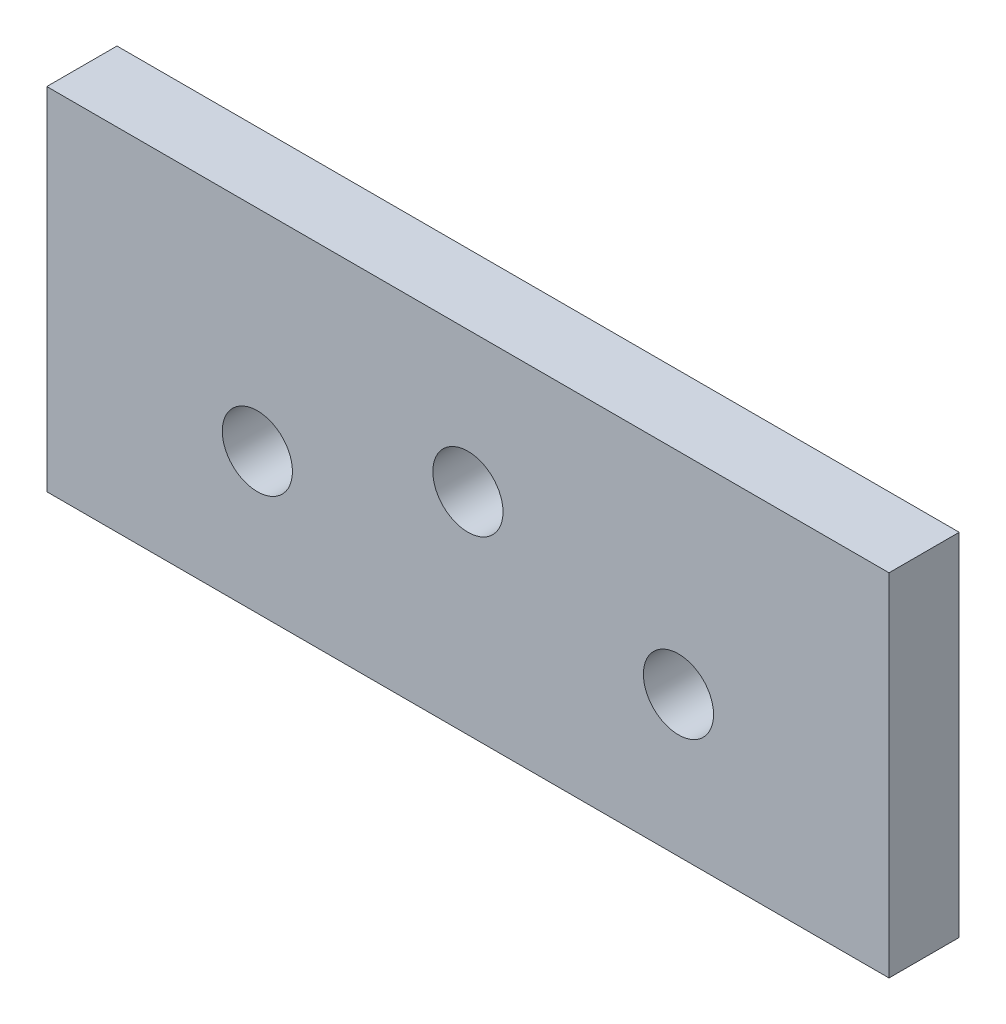
ISO-10303-21;
HEADER;
FILE_DESCRIPTION(('STEP AP214'),'2;1');
FILE_NAME('part.step','',(''),(''),'','','');
FILE_SCHEMA(('AUTOMOTIVE_DESIGN { 1 0 10303 214 1 1 1 1 }'));
ENDSEC;
DATA;
#1=APPLICATION_CONTEXT('core data for automotive mechanical design processes');
#2=APPLICATION_PROTOCOL_DEFINITION('international standard','automotive_design',2000,#1);
#3=PRODUCT_CONTEXT('',#1,'mechanical');
#4=PRODUCT('Part','Part','',(#3));
#5=PRODUCT_RELATED_PRODUCT_CATEGORY('part','',(#4));
#6=PRODUCT_DEFINITION_FORMATION('','',#4);
#7=PRODUCT_DEFINITION_CONTEXT('part definition',#1,'design');
#8=PRODUCT_DEFINITION('design','',#6,#7);
#9=PRODUCT_DEFINITION_SHAPE('','',#8);
#10=(LENGTH_UNIT() NAMED_UNIT(*) SI_UNIT(.MILLI.,.METRE.));
#11=(NAMED_UNIT(*) PLANE_ANGLE_UNIT() SI_UNIT($,.RADIAN.));
#12=(NAMED_UNIT(*) SI_UNIT($,.STERADIAN.) SOLID_ANGLE_UNIT());
#13=UNCERTAINTY_MEASURE_WITH_UNIT(LENGTH_MEASURE(1.E-05),#10,'distance_accuracy_value','');
#14=(GEOMETRIC_REPRESENTATION_CONTEXT(3) GLOBAL_UNCERTAINTY_ASSIGNED_CONTEXT((#13)) GLOBAL_UNIT_ASSIGNED_CONTEXT((#10,
#11,#12)) REPRESENTATION_CONTEXT('',''));
#15=CARTESIAN_POINT('',(0.,0.,0.));
#16=DIRECTION('',(0.,0.,1.));
#17=DIRECTION('',(1.,0.,0.));
#18=AXIS2_PLACEMENT_3D('',#15,#16,#17);
#19=CARTESIAN_POINT('',(0.,0.,10.));
#20=DIRECTION('',(0.,0.,1.));
#21=DIRECTION('',(1.,0.,0.));
#22=AXIS2_PLACEMENT_3D('',#19,#20,#21);
#23=PLANE('',#22);
#24=CARTESIAN_POINT('',(39.8281786941581,-30.,10.));
#25=DIRECTION('',(0.,0.,1.));
#26=DIRECTION('',(1.,0.,0.));
#27=AXIS2_PLACEMENT_3D('',#24,#25,#26);
#28=CIRCLE('',#27,5.);
#29=CARTESIAN_POINT('',(44.8281786941581,-30.,10.));
#30=VERTEX_POINT('',#29);
#31=EDGE_CURVE('E99',#30,#30,#28,.T.);
#32=ORIENTED_EDGE('',*,*,#31,.F.);
#33=EDGE_LOOP('',(#32));
#34=FACE_BOUND('',#33,.T.);
#35=DIRECTION('',(0.,-1.,0.));
#36=VECTOR('',#35,1.);
#37=CARTESIAN_POINT('',(-50.1718213058419,0.,10.));
#38=LINE('',#37,#36);
#39=CARTESIAN_POINT('',(-50.1718213058419,0.,10.));
#40=VERTEX_POINT('',#39);
#41=CARTESIAN_POINT('',(-50.1718213058419,-50.,10.));
#42=VERTEX_POINT('',#41);
#43=EDGE_CURVE('E69',#40,#42,#38,.T.);
#44=ORIENTED_EDGE('',*,*,#43,.T.);
#45=DIRECTION('',(1.,0.,0.));
#46=VECTOR('',#45,1.);
#47=CARTESIAN_POINT('',(-50.1718213058419,-50.,10.));
#48=LINE('',#47,#46);
#49=CARTESIAN_POINT('',(69.8281786941581,-50.,10.));
#50=VERTEX_POINT('',#49);
#51=EDGE_CURVE('E64',#42,#50,#48,.T.);
#52=ORIENTED_EDGE('',*,*,#51,.T.);
#53=DIRECTION('',(0.,1.,0.));
#54=VECTOR('',#53,1.);
#55=CARTESIAN_POINT('',(69.8281786941581,0.,10.));
#56=LINE('',#55,#54);
#57=CARTESIAN_POINT('',(69.8281786941581,0.,10.));
#58=VERTEX_POINT('',#57);
#59=EDGE_CURVE('E67',#50,#58,#56,.T.);
#60=ORIENTED_EDGE('',*,*,#59,.T.);
#61=DIRECTION('',(-1.,0.,0.));
#62=VECTOR('',#61,1.);
#63=CARTESIAN_POINT('',(-50.1718213058419,0.,10.));
#64=LINE('',#63,#62);
#65=EDGE_CURVE('E34',#58,#40,#64,.T.);
#66=ORIENTED_EDGE('',*,*,#65,.T.);
#67=EDGE_LOOP('',(#44,#52,#60,#66));
#68=FACE_BOUND('',#67,.T.);
#69=CARTESIAN_POINT('',(-20.1718213058419,-30.,10.));
#70=DIRECTION('',(0.,0.,1.));
#71=DIRECTION('',(1.,0.,0.));
#72=AXIS2_PLACEMENT_3D('',#69,#70,#71);
#73=CIRCLE('',#72,5.);
#74=CARTESIAN_POINT('',(-15.1718213058419,-30.,10.));
#75=VERTEX_POINT('',#74);
#76=EDGE_CURVE('E84',#75,#75,#73,.T.);
#77=ORIENTED_EDGE('',*,*,#76,.F.);
#78=EDGE_LOOP('',(#77));
#79=FACE_BOUND('',#78,.T.);
#80=CARTESIAN_POINT('',(9.8281786941581,-20.,10.));
#81=DIRECTION('',(0.,0.,1.));
#82=DIRECTION('',(1.,0.,0.));
#83=AXIS2_PLACEMENT_3D('',#80,#81,#82);
#84=CIRCLE('',#83,5.);
#85=CARTESIAN_POINT('',(14.8281786941581,-20.,10.));
#86=VERTEX_POINT('',#85);
#87=EDGE_CURVE('E105',#86,#86,#84,.T.);
#88=ORIENTED_EDGE('',*,*,#87,.F.);
#89=EDGE_LOOP('',(#88));
#90=FACE_BOUND('',#89,.T.);
#91=ADVANCED_FACE('F17',(#34,#68,#79,#90),#23,.T.);
#92=CARTESIAN_POINT('',(0.,0.,0.));
#93=DIRECTION('',(0.,0.,1.));
#94=DIRECTION('',(1.,0.,0.));
#95=AXIS2_PLACEMENT_3D('',#92,#93,#94);
#96=PLANE('',#95);
#97=DIRECTION('',(0.,-1.,0.));
#98=VECTOR('',#97,1.);
#99=CARTESIAN_POINT('',(-50.1718213058419,0.,0.));
#100=LINE('',#99,#98);
#101=CARTESIAN_POINT('',(-50.1718213058419,0.,0.));
#102=VERTEX_POINT('',#101);
#103=CARTESIAN_POINT('',(-50.1718213058419,-50.,0.));
#104=VERTEX_POINT('',#103);
#105=EDGE_CURVE('E81',#102,#104,#100,.T.);
#106=ORIENTED_EDGE('',*,*,#105,.F.);
#107=DIRECTION('',(-1.,0.,0.));
#108=VECTOR('',#107,1.);
#109=CARTESIAN_POINT('',(-50.1718213058419,0.,0.));
#110=LINE('',#109,#108);
#111=CARTESIAN_POINT('',(69.8281786941581,0.,0.));
#112=VERTEX_POINT('',#111);
#113=EDGE_CURVE('E57',#112,#102,#110,.T.);
#114=ORIENTED_EDGE('',*,*,#113,.F.);
#115=DIRECTION('',(0.,1.,0.));
#116=VECTOR('',#115,1.);
#117=CARTESIAN_POINT('',(69.8281786941581,0.,0.));
#118=LINE('',#117,#116);
#119=CARTESIAN_POINT('',(69.8281786941581,-50.,0.));
#120=VERTEX_POINT('',#119);
#121=EDGE_CURVE('E51',#120,#112,#118,.T.);
#122=ORIENTED_EDGE('',*,*,#121,.F.);
#123=DIRECTION('',(1.,0.,0.));
#124=VECTOR('',#123,1.);
#125=CARTESIAN_POINT('',(-50.1718213058419,-50.,0.));
#126=LINE('',#125,#124);
#127=EDGE_CURVE('E73',#104,#120,#126,.T.);
#128=ORIENTED_EDGE('',*,*,#127,.F.);
#129=EDGE_LOOP('',(#106,#114,#122,#128));
#130=FACE_BOUND('',#129,.T.);
#131=CARTESIAN_POINT('',(-20.1718213058419,-30.,0.));
#132=DIRECTION('',(0.,0.,1.));
#133=DIRECTION('',(1.,0.,0.));
#134=AXIS2_PLACEMENT_3D('',#131,#132,#133);
#135=CIRCLE('',#134,5.);
#136=CARTESIAN_POINT('',(-15.1718213058419,-30.,0.));
#137=VERTEX_POINT('',#136);
#138=EDGE_CURVE('E96',#137,#137,#135,.T.);
#139=ORIENTED_EDGE('',*,*,#138,.T.);
#140=EDGE_LOOP('',(#139));
#141=FACE_BOUND('',#140,.T.);
#142=CARTESIAN_POINT('',(39.8281786941581,-30.,0.));
#143=DIRECTION('',(0.,0.,1.));
#144=DIRECTION('',(1.,0.,0.));
#145=AXIS2_PLACEMENT_3D('',#142,#143,#144);
#146=CIRCLE('',#145,5.);
#147=CARTESIAN_POINT('',(44.8281786941581,-30.,0.));
#148=VERTEX_POINT('',#147);
#149=EDGE_CURVE('E102',#148,#148,#146,.T.);
#150=ORIENTED_EDGE('',*,*,#149,.T.);
#151=EDGE_LOOP('',(#150));
#152=FACE_BOUND('',#151,.T.);
#153=CARTESIAN_POINT('',(9.8281786941581,-20.,0.));
#154=DIRECTION('',(0.,0.,1.));
#155=DIRECTION('',(1.,0.,0.));
#156=AXIS2_PLACEMENT_3D('',#153,#154,#155);
#157=CIRCLE('',#156,5.);
#158=CARTESIAN_POINT('',(14.8281786941581,-20.,0.));
#159=VERTEX_POINT('',#158);
#160=EDGE_CURVE('E108',#159,#159,#157,.T.);
#161=ORIENTED_EDGE('',*,*,#160,.T.);
#162=EDGE_LOOP('',(#161));
#163=FACE_BOUND('',#162,.T.);
#164=ADVANCED_FACE('F92',(#130,#141,#152,#163),#96,.F.);
#165=CARTESIAN_POINT('',(-50.1718213058419,0.,10.));
#166=DIRECTION('',(1.,0.,0.));
#167=DIRECTION('',(0.,1.,0.));
#168=AXIS2_PLACEMENT_3D('',#165,#166,#167);
#169=PLANE('',#168);
#170=ORIENTED_EDGE('',*,*,#105,.T.);
#171=DIRECTION('',(0.,0.,-1.));
#172=VECTOR('',#171,1.);
#173=CARTESIAN_POINT('',(-50.1718213058419,-50.,10.));
#174=LINE('',#173,#172);
#175=EDGE_CURVE('E11',#42,#104,#174,.T.);
#176=ORIENTED_EDGE('',*,*,#175,.F.);
#177=ORIENTED_EDGE('',*,*,#43,.F.);
#178=DIRECTION('',(0.,0.,-1.));
#179=VECTOR('',#178,1.);
#180=CARTESIAN_POINT('',(-50.1718213058419,0.,10.));
#181=LINE('',#180,#179);
#182=EDGE_CURVE('E77',#40,#102,#181,.T.);
#183=ORIENTED_EDGE('',*,*,#182,.T.);
#184=EDGE_LOOP('',(#170,#176,#177,#183));
#185=FACE_BOUND('',#184,.T.);
#186=ADVANCED_FACE('F19',(#185),#169,.F.);
#187=CARTESIAN_POINT('',(-50.1718213058419,-50.,10.));
#188=DIRECTION('',(0.,1.,0.));
#189=DIRECTION('',(0.,0.,1.));
#190=AXIS2_PLACEMENT_3D('',#187,#188,#189);
#191=PLANE('',#190);
#192=ORIENTED_EDGE('',*,*,#127,.T.);
#193=DIRECTION('',(0.,0.,-1.));
#194=VECTOR('',#193,1.);
#195=CARTESIAN_POINT('',(69.8281786941581,-50.,10.));
#196=LINE('',#195,#194);
#197=EDGE_CURVE('E26',#50,#120,#196,.T.);
#198=ORIENTED_EDGE('',*,*,#197,.F.);
#199=ORIENTED_EDGE('',*,*,#51,.F.);
#200=ORIENTED_EDGE('',*,*,#175,.T.);
#201=EDGE_LOOP('',(#192,#198,#199,#200));
#202=FACE_BOUND('',#201,.T.);
#203=ADVANCED_FACE('F72',(#202),#191,.F.);
#204=CARTESIAN_POINT('',(69.8281786941581,0.,10.));
#205=DIRECTION('',(-1.,0.,0.));
#206=DIRECTION('',(0.,0.,1.));
#207=AXIS2_PLACEMENT_3D('',#204,#205,#206);
#208=PLANE('',#207);
#209=ORIENTED_EDGE('',*,*,#121,.T.);
#210=DIRECTION('',(0.,0.,-1.));
#211=VECTOR('',#210,1.);
#212=CARTESIAN_POINT('',(69.8281786941581,0.,10.));
#213=LINE('',#212,#211);
#214=EDGE_CURVE('E74',#58,#112,#213,.T.);
#215=ORIENTED_EDGE('',*,*,#214,.F.);
#216=ORIENTED_EDGE('',*,*,#59,.F.);
#217=ORIENTED_EDGE('',*,*,#197,.T.);
#218=EDGE_LOOP('',(#209,#215,#216,#217));
#219=FACE_BOUND('',#218,.T.);
#220=ADVANCED_FACE('F75',(#219),#208,.F.);
#221=CARTESIAN_POINT('',(-50.1718213058419,0.,10.));
#222=DIRECTION('',(0.,-1.,0.));
#223=DIRECTION('',(0.,0.,-1.));
#224=AXIS2_PLACEMENT_3D('',#221,#222,#223);
#225=PLANE('',#224);
#226=ORIENTED_EDGE('',*,*,#113,.T.);
#227=ORIENTED_EDGE('',*,*,#182,.F.);
#228=ORIENTED_EDGE('',*,*,#65,.F.);
#229=ORIENTED_EDGE('',*,*,#214,.T.);
#230=EDGE_LOOP('',(#226,#227,#228,#229));
#231=FACE_BOUND('',#230,.T.);
#232=ADVANCED_FACE('F89',(#231),#225,.F.);
#233=CARTESIAN_POINT('',(-20.1718213058419,-30.,10.));
#234=DIRECTION('',(0.,0.,-1.));
#235=DIRECTION('',(-1.,0.,0.));
#236=AXIS2_PLACEMENT_3D('',#233,#234,#235);
#237=CYLINDRICAL_SURFACE('',#236,5.);
#238=ORIENTED_EDGE('',*,*,#76,.T.);
#239=EDGE_LOOP('',(#238));
#240=FACE_BOUND('',#239,.T.);
#241=ORIENTED_EDGE('',*,*,#138,.F.);
#242=EDGE_LOOP('',(#241));
#243=FACE_BOUND('',#242,.T.);
#244=ADVANCED_FACE('F128',(#240,#243),#237,.F.);
#245=CARTESIAN_POINT('',(39.8281786941581,-30.,10.));
#246=DIRECTION('',(0.,0.,-1.));
#247=DIRECTION('',(-1.,0.,0.));
#248=AXIS2_PLACEMENT_3D('',#245,#246,#247);
#249=CYLINDRICAL_SURFACE('',#248,5.);
#250=ORIENTED_EDGE('',*,*,#31,.T.);
#251=EDGE_LOOP('',(#250));
#252=FACE_BOUND('',#251,.T.);
#253=ORIENTED_EDGE('',*,*,#149,.F.);
#254=EDGE_LOOP('',(#253));
#255=FACE_BOUND('',#254,.T.);
#256=ADVANCED_FACE('F177',(#252,#255),#249,.F.);
#257=CARTESIAN_POINT('',(9.8281786941581,-20.,10.));
#258=DIRECTION('',(0.,0.,-1.));
#259=DIRECTION('',(-1.,0.,0.));
#260=AXIS2_PLACEMENT_3D('',#257,#258,#259);
#261=CYLINDRICAL_SURFACE('',#260,5.);
#262=ORIENTED_EDGE('',*,*,#87,.T.);
#263=EDGE_LOOP('',(#262));
#264=FACE_BOUND('',#263,.T.);
#265=ORIENTED_EDGE('',*,*,#160,.F.);
#266=EDGE_LOOP('',(#265));
#267=FACE_BOUND('',#266,.T.);
#268=ADVANCED_FACE('F114',(#264,#267),#261,.F.);
#269=CLOSED_SHELL('',(#91,#164,#186,#203,#220,#232,#244,#256,#268));
#270=MANIFOLD_SOLID_BREP('B1',#269);
#271=ADVANCED_BREP_SHAPE_REPRESENTATION('',(#18,#270),#14);
#272=SHAPE_DEFINITION_REPRESENTATION(#9,#271);
ENDSEC;
END-ISO-10303-21;
